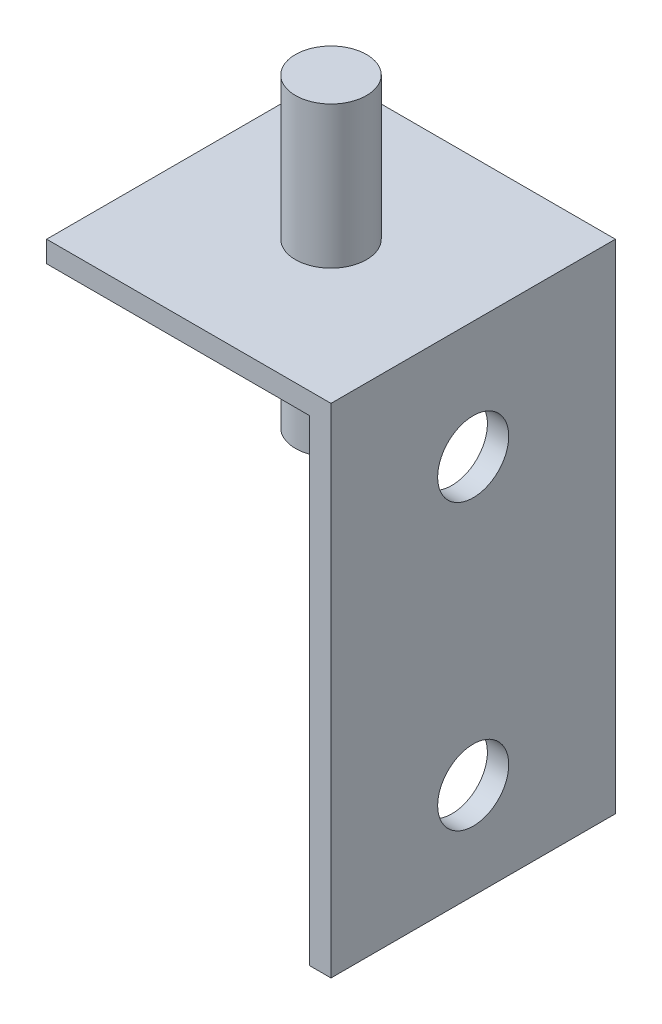
ISO-10303-21;
HEADER;
FILE_DESCRIPTION(('STEP AP214'),'2;1');
FILE_NAME('part.step','',(''),(''),'','','');
FILE_SCHEMA(('AUTOMOTIVE_DESIGN { 1 0 10303 214 1 1 1 1 }'));
ENDSEC;
DATA;
#1=APPLICATION_CONTEXT('core data for automotive mechanical design processes');
#2=APPLICATION_PROTOCOL_DEFINITION('international standard','automotive_design',2000,#1);
#3=PRODUCT_CONTEXT('',#1,'mechanical');
#4=PRODUCT('Part','Part','',(#3));
#5=PRODUCT_RELATED_PRODUCT_CATEGORY('part','',(#4));
#6=PRODUCT_DEFINITION_FORMATION('','',#4);
#7=PRODUCT_DEFINITION_CONTEXT('part definition',#1,'design');
#8=PRODUCT_DEFINITION('design','',#6,#7);
#9=PRODUCT_DEFINITION_SHAPE('','',#8);
#10=(LENGTH_UNIT() NAMED_UNIT(*) SI_UNIT(.MILLI.,.METRE.));
#11=(NAMED_UNIT(*) PLANE_ANGLE_UNIT() SI_UNIT($,.RADIAN.));
#12=(NAMED_UNIT(*) SI_UNIT($,.STERADIAN.) SOLID_ANGLE_UNIT());
#13=UNCERTAINTY_MEASURE_WITH_UNIT(LENGTH_MEASURE(1.E-05),#10,'distance_accuracy_value','');
#14=(GEOMETRIC_REPRESENTATION_CONTEXT(3) GLOBAL_UNCERTAINTY_ASSIGNED_CONTEXT((#13)) GLOBAL_UNIT_ASSIGNED_CONTEXT((#10,
#11,#12)) REPRESENTATION_CONTEXT('',''));
#15=CARTESIAN_POINT('',(0.,0.,0.));
#16=DIRECTION('',(0.,0.,1.));
#17=DIRECTION('',(1.,0.,0.));
#18=AXIS2_PLACEMENT_3D('',#15,#16,#17);
#19=CARTESIAN_POINT('',(0.,0.,0.));
#20=DIRECTION('',(0.,0.,-1.));
#21=DIRECTION('',(-1.,0.,0.));
#22=AXIS2_PLACEMENT_3D('',#19,#20,#21);
#23=PLANE('',#22);
#24=DIRECTION('',(-1.,0.,0.));
#25=VECTOR('',#24,1.);
#26=CARTESIAN_POINT('',(0.,0.,0.));
#27=LINE('',#26,#25);
#28=CARTESIAN_POINT('',(0.,0.,0.));
#29=VERTEX_POINT('',#28);
#30=CARTESIAN_POINT('',(-40.,0.,0.));
#31=VERTEX_POINT('',#30);
#32=EDGE_CURVE('E124',#29,#31,#27,.T.);
#33=ORIENTED_EDGE('',*,*,#32,.F.);
#34=DIRECTION('',(0.,1.,0.));
#35=VECTOR('',#34,1.);
#36=CARTESIAN_POINT('',(0.,0.,0.));
#37=LINE('',#36,#35);
#38=CARTESIAN_POINT('',(0.,-70.,0.));
#39=VERTEX_POINT('',#38);
#40=EDGE_CURVE('E85',#39,#29,#37,.T.);
#41=ORIENTED_EDGE('',*,*,#40,.F.);
#42=DIRECTION('',(1.,0.,0.));
#43=VECTOR('',#42,1.);
#44=CARTESIAN_POINT('',(0.,-70.,0.));
#45=LINE('',#44,#43);
#46=CARTESIAN_POINT('',(-2.99999999999999,-70.,0.));
#47=VERTEX_POINT('',#46);
#48=EDGE_CURVE('E42',#47,#39,#45,.T.);
#49=ORIENTED_EDGE('',*,*,#48,.F.);
#50=DIRECTION('',(0.,1.,0.));
#51=VECTOR('',#50,1.);
#52=CARTESIAN_POINT('',(-3.,0.,0.));
#53=LINE('',#52,#51);
#54=CARTESIAN_POINT('',(-3.,-3.,0.));
#55=VERTEX_POINT('',#54);
#56=EDGE_CURVE('E83',#47,#55,#53,.T.);
#57=ORIENTED_EDGE('',*,*,#56,.T.);
#58=DIRECTION('',(-1.,0.,0.));
#59=VECTOR('',#58,1.);
#60=CARTESIAN_POINT('',(0.,-3.,0.));
#61=LINE('',#60,#59);
#62=CARTESIAN_POINT('',(-40.,-3.,0.));
#63=VERTEX_POINT('',#62);
#64=EDGE_CURVE('E108',#55,#63,#61,.T.);
#65=ORIENTED_EDGE('',*,*,#64,.T.);
#66=DIRECTION('',(0.,1.,0.));
#67=VECTOR('',#66,1.);
#68=CARTESIAN_POINT('',(-40.,0.,0.));
#69=LINE('',#68,#67);
#70=EDGE_CURVE('E51',#63,#31,#69,.T.);
#71=ORIENTED_EDGE('',*,*,#70,.T.);
#72=EDGE_LOOP('',(#33,#41,#49,#57,#65,#71));
#73=FACE_BOUND('',#72,.T.);
#74=ADVANCED_FACE('F32',(#73),#23,.T.);
#75=CARTESIAN_POINT('',(-40.,0.,0.));
#76=DIRECTION('',(-1.,0.,0.));
#77=DIRECTION('',(0.,0.,1.));
#78=AXIS2_PLACEMENT_3D('',#75,#76,#77);
#79=PLANE('',#78);
#80=ORIENTED_EDGE('',*,*,#70,.F.);
#81=DIRECTION('',(0.,0.,1.));
#82=VECTOR('',#81,1.);
#83=CARTESIAN_POINT('',(-40.,-3.,0.));
#84=LINE('',#83,#82);
#85=CARTESIAN_POINT('',(-40.,-3.,40.));
#86=VERTEX_POINT('',#85);
#87=EDGE_CURVE('E134',#63,#86,#84,.T.);
#88=ORIENTED_EDGE('',*,*,#87,.T.);
#89=DIRECTION('',(0.,1.,0.));
#90=VECTOR('',#89,1.);
#91=CARTESIAN_POINT('',(-40.,0.,40.));
#92=LINE('',#91,#90);
#93=CARTESIAN_POINT('',(-40.,0.,40.));
#94=VERTEX_POINT('',#93);
#95=EDGE_CURVE('E111',#86,#94,#92,.T.);
#96=ORIENTED_EDGE('',*,*,#95,.T.);
#97=DIRECTION('',(0.,0.,1.));
#98=VECTOR('',#97,1.);
#99=CARTESIAN_POINT('',(-40.,0.,0.));
#100=LINE('',#99,#98);
#101=EDGE_CURVE('E127',#31,#94,#100,.T.);
#102=ORIENTED_EDGE('',*,*,#101,.F.);
#103=EDGE_LOOP('',(#80,#88,#96,#102));
#104=FACE_BOUND('',#103,.T.);
#105=ADVANCED_FACE('F144',(#104),#79,.T.);
#106=CARTESIAN_POINT('',(0.,0.,40.));
#107=DIRECTION('',(0.,0.,-1.));
#108=DIRECTION('',(0.,1.,0.));
#109=AXIS2_PLACEMENT_3D('',#106,#107,#108);
#110=PLANE('',#109);
#111=DIRECTION('',(0.,1.,0.));
#112=VECTOR('',#111,1.);
#113=CARTESIAN_POINT('',(0.,0.,40.));
#114=LINE('',#113,#112);
#115=CARTESIAN_POINT('',(0.,-70.,40.));
#116=VERTEX_POINT('',#115);
#117=CARTESIAN_POINT('',(0.,0.,40.));
#118=VERTEX_POINT('',#117);
#119=EDGE_CURVE('E121',#116,#118,#114,.T.);
#120=ORIENTED_EDGE('',*,*,#119,.T.);
#121=DIRECTION('',(-1.,0.,0.));
#122=VECTOR('',#121,1.);
#123=CARTESIAN_POINT('',(0.,0.,40.));
#124=LINE('',#123,#122);
#125=EDGE_CURVE('E102',#118,#94,#124,.T.);
#126=ORIENTED_EDGE('',*,*,#125,.T.);
#127=ORIENTED_EDGE('',*,*,#95,.F.);
#128=DIRECTION('',(-1.,0.,0.));
#129=VECTOR('',#128,1.);
#130=CARTESIAN_POINT('',(0.,-3.,40.));
#131=LINE('',#130,#129);
#132=CARTESIAN_POINT('',(-3.,-3.,40.));
#133=VERTEX_POINT('',#132);
#134=EDGE_CURVE('E132',#133,#86,#131,.T.);
#135=ORIENTED_EDGE('',*,*,#134,.F.);
#136=DIRECTION('',(0.,1.,0.));
#137=VECTOR('',#136,1.);
#138=CARTESIAN_POINT('',(-3.,0.,40.));
#139=LINE('',#138,#137);
#140=CARTESIAN_POINT('',(-2.99999999999999,-70.,40.));
#141=VERTEX_POINT('',#140);
#142=EDGE_CURVE('E97',#141,#133,#139,.T.);
#143=ORIENTED_EDGE('',*,*,#142,.F.);
#144=DIRECTION('',(1.,0.,0.));
#145=VECTOR('',#144,1.);
#146=CARTESIAN_POINT('',(0.,-70.,40.));
#147=LINE('',#146,#145);
#148=EDGE_CURVE('E93',#141,#116,#147,.T.);
#149=ORIENTED_EDGE('',*,*,#148,.T.);
#150=EDGE_LOOP('',(#120,#126,#127,#135,#143,#149));
#151=FACE_BOUND('',#150,.T.);
#152=ADVANCED_FACE('F142',(#151),#110,.F.);
#153=CARTESIAN_POINT('',(0.,-70.,0.));
#154=DIRECTION('',(0.,1.,0.));
#155=DIRECTION('',(0.,0.,1.));
#156=AXIS2_PLACEMENT_3D('',#153,#154,#155);
#157=PLANE('',#156);
#158=DIRECTION('',(0.,0.,1.));
#159=VECTOR('',#158,1.);
#160=CARTESIAN_POINT('',(-2.99999999999999,-70.,0.));
#161=LINE('',#160,#159);
#162=EDGE_CURVE('E92',#47,#141,#161,.T.);
#163=ORIENTED_EDGE('',*,*,#162,.F.);
#164=ORIENTED_EDGE('',*,*,#48,.T.);
#165=DIRECTION('',(0.,0.,1.));
#166=VECTOR('',#165,1.);
#167=CARTESIAN_POINT('',(0.,-70.,0.));
#168=LINE('',#167,#166);
#169=EDGE_CURVE('E116',#39,#116,#168,.T.);
#170=ORIENTED_EDGE('',*,*,#169,.T.);
#171=ORIENTED_EDGE('',*,*,#148,.F.);
#172=EDGE_LOOP('',(#163,#164,#170,#171));
#173=FACE_BOUND('',#172,.T.);
#174=ADVANCED_FACE('F34',(#173),#157,.F.);
#175=CARTESIAN_POINT('',(0.,0.,0.));
#176=DIRECTION('',(1.,0.,0.));
#177=DIRECTION('',(0.,1.,0.));
#178=AXIS2_PLACEMENT_3D('',#175,#176,#177);
#179=PLANE('',#178);
#180=CARTESIAN_POINT('',(0.,-16.5,20.));
#181=DIRECTION('',(1.,0.,0.));
#182=DIRECTION('',(0.,1.,0.));
#183=AXIS2_PLACEMENT_3D('',#180,#181,#182);
#184=CIRCLE('',#183,5.);
#185=CARTESIAN_POINT('',(0.,-11.5,20.));
#186=VERTEX_POINT('',#185);
#187=EDGE_CURVE('E184',#186,#186,#184,.T.);
#188=ORIENTED_EDGE('',*,*,#187,.F.);
#189=EDGE_LOOP('',(#188));
#190=FACE_BOUND('',#189,.T.);
#191=CARTESIAN_POINT('',(0.,-56.5,20.));
#192=DIRECTION('',(1.,0.,0.));
#193=DIRECTION('',(0.,1.,0.));
#194=AXIS2_PLACEMENT_3D('',#191,#192,#193);
#195=CIRCLE('',#194,5.);
#196=CARTESIAN_POINT('',(0.,-51.5,20.));
#197=VERTEX_POINT('',#196);
#198=EDGE_CURVE('E183',#197,#197,#195,.T.);
#199=ORIENTED_EDGE('',*,*,#198,.F.);
#200=EDGE_LOOP('',(#199));
#201=FACE_BOUND('',#200,.T.);
#202=ORIENTED_EDGE('',*,*,#119,.F.);
#203=ORIENTED_EDGE('',*,*,#169,.F.);
#204=ORIENTED_EDGE('',*,*,#40,.T.);
#205=DIRECTION('',(0.,0.,1.));
#206=VECTOR('',#205,1.);
#207=CARTESIAN_POINT('',(0.,0.,0.));
#208=LINE('',#207,#206);
#209=EDGE_CURVE('E105',#29,#118,#208,.T.);
#210=ORIENTED_EDGE('',*,*,#209,.T.);
#211=EDGE_LOOP('',(#202,#203,#204,#210));
#212=FACE_BOUND('',#211,.T.);
#213=ADVANCED_FACE('F147',(#190,#201,#212),#179,.T.);
#214=CARTESIAN_POINT('',(0.,0.,0.));
#215=DIRECTION('',(0.,1.,0.));
#216=DIRECTION('',(-1.,0.,0.));
#217=AXIS2_PLACEMENT_3D('',#214,#215,#216);
#218=PLANE('',#217);
#219=CARTESIAN_POINT('',(-20.,0.,20.));
#220=DIRECTION('',(0.,1.,0.));
#221=DIRECTION('',(-1.,0.,0.));
#222=AXIS2_PLACEMENT_3D('',#219,#220,#221);
#223=CIRCLE('',#222,5.);
#224=CARTESIAN_POINT('',(-25.,0.,20.));
#225=VERTEX_POINT('',#224);
#226=EDGE_CURVE('E11',#225,#225,#223,.T.);
#227=ORIENTED_EDGE('',*,*,#226,.F.);
#228=EDGE_LOOP('',(#227));
#229=FACE_BOUND('',#228,.T.);
#230=ORIENTED_EDGE('',*,*,#125,.F.);
#231=ORIENTED_EDGE('',*,*,#209,.F.);
#232=ORIENTED_EDGE('',*,*,#32,.T.);
#233=ORIENTED_EDGE('',*,*,#101,.T.);
#234=EDGE_LOOP('',(#230,#231,#232,#233));
#235=FACE_BOUND('',#234,.T.);
#236=ADVANCED_FACE('F146',(#229,#235),#218,.T.);
#237=CARTESIAN_POINT('',(-3.,0.,0.));
#238=DIRECTION('',(1.,0.,0.));
#239=DIRECTION('',(0.,1.,0.));
#240=AXIS2_PLACEMENT_3D('',#237,#238,#239);
#241=PLANE('',#240);
#242=CARTESIAN_POINT('',(-3.,-16.5,20.));
#243=DIRECTION('',(-1.,0.,0.));
#244=DIRECTION('',(0.,1.,0.));
#245=AXIS2_PLACEMENT_3D('',#242,#243,#244);
#246=CIRCLE('',#245,5.);
#247=CARTESIAN_POINT('',(-3.,-11.5,20.));
#248=VERTEX_POINT('',#247);
#249=EDGE_CURVE('E178',#248,#248,#246,.T.);
#250=ORIENTED_EDGE('',*,*,#249,.F.);
#251=EDGE_LOOP('',(#250));
#252=FACE_BOUND('',#251,.T.);
#253=CARTESIAN_POINT('',(-2.99999999999999,-56.5,20.));
#254=DIRECTION('',(-1.,0.,0.));
#255=DIRECTION('',(0.,-1.,0.));
#256=AXIS2_PLACEMENT_3D('',#253,#254,#255);
#257=CIRCLE('',#256,5.);
#258=CARTESIAN_POINT('',(-2.99999999999999,-61.5,20.));
#259=VERTEX_POINT('',#258);
#260=EDGE_CURVE('E181',#259,#259,#257,.T.);
#261=ORIENTED_EDGE('',*,*,#260,.F.);
#262=EDGE_LOOP('',(#261));
#263=FACE_BOUND('',#262,.T.);
#264=ORIENTED_EDGE('',*,*,#142,.T.);
#265=DIRECTION('',(0.,0.,1.));
#266=VECTOR('',#265,1.);
#267=CARTESIAN_POINT('',(-3.,-3.,0.));
#268=LINE('',#267,#266);
#269=EDGE_CURVE('E100',#55,#133,#268,.T.);
#270=ORIENTED_EDGE('',*,*,#269,.F.);
#271=ORIENTED_EDGE('',*,*,#56,.F.);
#272=ORIENTED_EDGE('',*,*,#162,.T.);
#273=EDGE_LOOP('',(#264,#270,#271,#272));
#274=FACE_BOUND('',#273,.T.);
#275=ADVANCED_FACE('F99',(#252,#263,#274),#241,.F.);
#276=CARTESIAN_POINT('',(0.,-3.,0.));
#277=DIRECTION('',(0.,1.,0.));
#278=DIRECTION('',(-1.,0.,0.));
#279=AXIS2_PLACEMENT_3D('',#276,#277,#278);
#280=PLANE('',#279);
#281=CARTESIAN_POINT('',(-20.,-3.,20.));
#282=DIRECTION('',(0.,1.,0.));
#283=DIRECTION('',(-1.,0.,0.));
#284=AXIS2_PLACEMENT_3D('',#281,#282,#283);
#285=CIRCLE('',#284,5.);
#286=CARTESIAN_POINT('',(-25.,-3.,20.));
#287=VERTEX_POINT('',#286);
#288=EDGE_CURVE('E36',#287,#287,#285,.T.);
#289=ORIENTED_EDGE('',*,*,#288,.T.);
#290=EDGE_LOOP('',(#289));
#291=FACE_BOUND('',#290,.T.);
#292=ORIENTED_EDGE('',*,*,#134,.T.);
#293=ORIENTED_EDGE('',*,*,#87,.F.);
#294=ORIENTED_EDGE('',*,*,#64,.F.);
#295=ORIENTED_EDGE('',*,*,#269,.T.);
#296=EDGE_LOOP('',(#292,#293,#294,#295));
#297=FACE_BOUND('',#296,.T.);
#298=ADVANCED_FACE('F140',(#291,#297),#280,.F.);
#299=CARTESIAN_POINT('',(-20.,-23.,20.));
#300=DIRECTION('',(0.,1.,0.));
#301=DIRECTION('',(-1.,0.,0.));
#302=AXIS2_PLACEMENT_3D('',#299,#300,#301);
#303=PLANE('',#302);
#304=CARTESIAN_POINT('',(-20.,-23.,20.));
#305=DIRECTION('',(0.,1.,0.));
#306=DIRECTION('',(-1.,0.,0.));
#307=AXIS2_PLACEMENT_3D('',#304,#305,#306);
#308=CIRCLE('',#307,5.);
#309=CARTESIAN_POINT('',(-25.,-23.,20.));
#310=VERTEX_POINT('',#309);
#311=EDGE_CURVE('E195',#310,#310,#308,.T.);
#312=ORIENTED_EDGE('',*,*,#311,.F.);
#313=EDGE_LOOP('',(#312));
#314=FACE_BOUND('',#313,.T.);
#315=ADVANCED_FACE('F169',(#314),#303,.F.);
#316=CARTESIAN_POINT('',(-20.,-23.,20.));
#317=DIRECTION('',(0.,1.,0.));
#318=DIRECTION('',(-1.,0.,0.));
#319=AXIS2_PLACEMENT_3D('',#316,#317,#318);
#320=CYLINDRICAL_SURFACE('',#319,5.);
#321=ORIENTED_EDGE('',*,*,#311,.T.);
#322=EDGE_LOOP('',(#321));
#323=FACE_BOUND('',#322,.T.);
#324=ORIENTED_EDGE('',*,*,#288,.F.);
#325=EDGE_LOOP('',(#324));
#326=FACE_BOUND('',#325,.T.);
#327=ADVANCED_FACE('F202',(#323,#326),#320,.T.);
#328=ORIENTED_EDGE('',*,*,#226,.T.);
#329=EDGE_LOOP('',(#328));
#330=FACE_BOUND('',#329,.T.);
#331=CARTESIAN_POINT('',(-20.,20.,20.));
#332=DIRECTION('',(0.,1.,0.));
#333=DIRECTION('',(-1.,0.,0.));
#334=AXIS2_PLACEMENT_3D('',#331,#332,#333);
#335=CIRCLE('',#334,5.);
#336=CARTESIAN_POINT('',(-25.,20.,20.));
#337=VERTEX_POINT('',#336);
#338=EDGE_CURVE('E187',#337,#337,#335,.T.);
#339=ORIENTED_EDGE('',*,*,#338,.F.);
#340=EDGE_LOOP('',(#339));
#341=FACE_BOUND('',#340,.T.);
#342=ADVANCED_FACE('F204',(#330,#341),#320,.T.);
#343=CARTESIAN_POINT('',(-20.,20.,20.));
#344=DIRECTION('',(0.,1.,0.));
#345=DIRECTION('',(-1.,0.,0.));
#346=AXIS2_PLACEMENT_3D('',#343,#344,#345);
#347=PLANE('',#346);
#348=ORIENTED_EDGE('',*,*,#338,.T.);
#349=EDGE_LOOP('',(#348));
#350=FACE_BOUND('',#349,.T.);
#351=ADVANCED_FACE('F210',(#350),#347,.T.);
#352=CARTESIAN_POINT('',(17.,-56.5,20.));
#353=DIRECTION('',(-1.,0.,0.));
#354=DIRECTION('',(0.,-1.,0.));
#355=AXIS2_PLACEMENT_3D('',#352,#353,#354);
#356=CYLINDRICAL_SURFACE('',#355,5.);
#357=ORIENTED_EDGE('',*,*,#198,.T.);
#358=EDGE_LOOP('',(#357));
#359=FACE_BOUND('',#358,.T.);
#360=ORIENTED_EDGE('',*,*,#260,.T.);
#361=EDGE_LOOP('',(#360));
#362=FACE_BOUND('',#361,.T.);
#363=ADVANCED_FACE('F217',(#359,#362),#356,.F.);
#364=CARTESIAN_POINT('',(17.,-16.5,20.));
#365=DIRECTION('',(-1.,0.,0.));
#366=DIRECTION('',(0.,-1.,0.));
#367=AXIS2_PLACEMENT_3D('',#364,#365,#366);
#368=CYLINDRICAL_SURFACE('',#367,5.);
#369=ORIENTED_EDGE('',*,*,#187,.T.);
#370=EDGE_LOOP('',(#369));
#371=FACE_BOUND('',#370,.T.);
#372=ORIENTED_EDGE('',*,*,#249,.T.);
#373=EDGE_LOOP('',(#372));
#374=FACE_BOUND('',#373,.T.);
#375=ADVANCED_FACE('F221',(#371,#374),#368,.F.);
#376=CLOSED_SHELL('',(#74,#105,#152,#174,#213,#236,#275,#298,#315,#327,#342,#351,#363,#375));
#377=MANIFOLD_SOLID_BREP('B2',#376);
#378=ADVANCED_BREP_SHAPE_REPRESENTATION('',(#18,#377),#14);
#379=SHAPE_DEFINITION_REPRESENTATION(#9,#378);
ENDSEC;
END-ISO-10303-21;
